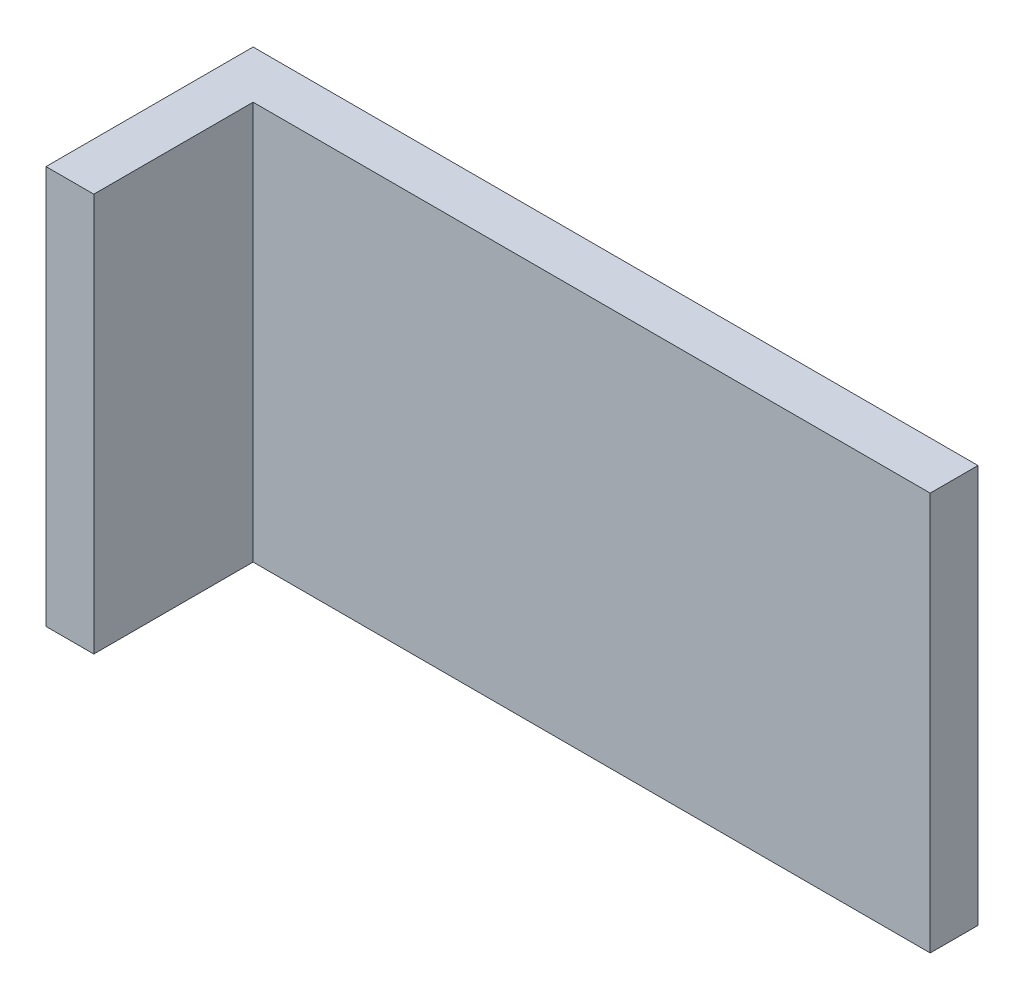
ISO-10303-21;
HEADER;
FILE_DESCRIPTION(('STEP AP214'),'2;1');
FILE_NAME('part.step','',(''),(''),'','','');
FILE_SCHEMA(('AUTOMOTIVE_DESIGN { 1 0 10303 214 1 1 1 1 }'));
ENDSEC;
DATA;
#1=APPLICATION_CONTEXT('core data for automotive mechanical design processes');
#2=APPLICATION_PROTOCOL_DEFINITION('international standard','automotive_design',2000,#1);
#3=PRODUCT_CONTEXT('',#1,'mechanical');
#4=PRODUCT('Part','Part','',(#3));
#5=PRODUCT_RELATED_PRODUCT_CATEGORY('part','',(#4));
#6=PRODUCT_DEFINITION_FORMATION('','',#4);
#7=PRODUCT_DEFINITION_CONTEXT('part definition',#1,'design');
#8=PRODUCT_DEFINITION('design','',#6,#7);
#9=PRODUCT_DEFINITION_SHAPE('','',#8);
#10=(LENGTH_UNIT() NAMED_UNIT(*) SI_UNIT(.MILLI.,.METRE.));
#11=(NAMED_UNIT(*) PLANE_ANGLE_UNIT() SI_UNIT($,.RADIAN.));
#12=(NAMED_UNIT(*) SI_UNIT($,.STERADIAN.) SOLID_ANGLE_UNIT());
#13=UNCERTAINTY_MEASURE_WITH_UNIT(LENGTH_MEASURE(1.E-05),#10,'distance_accuracy_value','');
#14=(GEOMETRIC_REPRESENTATION_CONTEXT(3) GLOBAL_UNCERTAINTY_ASSIGNED_CONTEXT((#13)) GLOBAL_UNIT_ASSIGNED_CONTEXT((#10,
#11,#12)) REPRESENTATION_CONTEXT('',''));
#15=CARTESIAN_POINT('',(0.,0.,0.));
#16=DIRECTION('',(0.,0.,1.));
#17=DIRECTION('',(1.,0.,0.));
#18=AXIS2_PLACEMENT_3D('',#15,#16,#17);
#19=CARTESIAN_POINT('',(-0.03,0.25,0.));
#20=DIRECTION('',(1.,0.,0.));
#21=DIRECTION('',(0.,0.,-1.));
#22=AXIS2_PLACEMENT_3D('',#19,#20,#21);
#23=PLANE('',#22);
#24=DIRECTION('',(0.,1.,0.));
#25=VECTOR('',#24,1.);
#26=CARTESIAN_POINT('',(-0.03,0.,0.));
#27=LINE('',#26,#25);
#28=CARTESIAN_POINT('',(-0.03,0.,0.));
#29=VERTEX_POINT('',#28);
#30=CARTESIAN_POINT('',(-0.03,0.25,0.));
#31=VERTEX_POINT('',#30);
#32=EDGE_CURVE('E20',#29,#31,#27,.T.);
#33=ORIENTED_EDGE('',*,*,#32,.F.);
#34=DIRECTION('',(0.,0.,1.));
#35=VECTOR('',#34,1.);
#36=CARTESIAN_POINT('',(-0.03,0.,0.));
#37=LINE('',#36,#35);
#38=CARTESIAN_POINT('',(-0.03,0.,0.13));
#39=VERTEX_POINT('',#38);
#40=EDGE_CURVE('E68',#29,#39,#37,.T.);
#41=ORIENTED_EDGE('',*,*,#40,.T.);
#42=DIRECTION('',(0.,1.,0.));
#43=VECTOR('',#42,1.);
#44=CARTESIAN_POINT('',(-0.03,0.,0.13));
#45=LINE('',#44,#43);
#46=CARTESIAN_POINT('',(-0.03,0.25,0.13));
#47=VERTEX_POINT('',#46);
#48=EDGE_CURVE('E89',#39,#47,#45,.T.);
#49=ORIENTED_EDGE('',*,*,#48,.T.);
#50=DIRECTION('',(0.,0.,-1.));
#51=VECTOR('',#50,1.);
#52=CARTESIAN_POINT('',(-0.03,0.25,0.13));
#53=LINE('',#52,#51);
#54=EDGE_CURVE('E87',#47,#31,#53,.T.);
#55=ORIENTED_EDGE('',*,*,#54,.T.);
#56=EDGE_LOOP('',(#33,#41,#49,#55));
#57=FACE_BOUND('',#56,.T.);
#58=ADVANCED_FACE('F17',(#57),#23,.F.);
#59=CARTESIAN_POINT('',(0.,0.,0.13));
#60=DIRECTION('',(0.,0.,-1.));
#61=DIRECTION('',(-1.,0.,0.));
#62=AXIS2_PLACEMENT_3D('',#59,#60,#61);
#63=PLANE('',#62);
#64=DIRECTION('',(-1.,0.,0.));
#65=VECTOR('',#64,1.);
#66=CARTESIAN_POINT('',(0.,0.25,0.13));
#67=LINE('',#66,#65);
#68=CARTESIAN_POINT('',(0.,0.25,0.13));
#69=VERTEX_POINT('',#68);
#70=EDGE_CURVE('E93',#47,#69,#67,.F.);
#71=ORIENTED_EDGE('',*,*,#70,.F.);
#72=ORIENTED_EDGE('',*,*,#48,.F.);
#73=DIRECTION('',(-1.,0.,0.));
#74=VECTOR('',#73,1.);
#75=CARTESIAN_POINT('',(0.,0.,0.13));
#76=LINE('',#75,#74);
#77=CARTESIAN_POINT('',(0.,0.,0.13));
#78=VERTEX_POINT('',#77);
#79=EDGE_CURVE('E79',#78,#39,#76,.T.);
#80=ORIENTED_EDGE('',*,*,#79,.F.);
#81=DIRECTION('',(0.,1.,0.));
#82=VECTOR('',#81,1.);
#83=CARTESIAN_POINT('',(0.,0.,0.13));
#84=LINE('',#83,#82);
#85=EDGE_CURVE('E102',#69,#78,#84,.F.);
#86=ORIENTED_EDGE('',*,*,#85,.F.);
#87=EDGE_LOOP('',(#71,#72,#80,#86));
#88=FACE_BOUND('',#87,.T.);
#89=ADVANCED_FACE('F141',(#88),#63,.F.);
#90=CARTESIAN_POINT('',(-0.03,0.,0.));
#91=DIRECTION('',(0.,0.,-1.));
#92=DIRECTION('',(-1.,0.,0.));
#93=AXIS2_PLACEMENT_3D('',#90,#91,#92);
#94=PLANE('',#93);
#95=DIRECTION('',(1.,0.,0.));
#96=VECTOR('',#95,1.);
#97=CARTESIAN_POINT('',(0.425,0.25,0.));
#98=LINE('',#97,#96);
#99=CARTESIAN_POINT('',(0.425,0.25,0.));
#100=VERTEX_POINT('',#99);
#101=EDGE_CURVE('E105',#31,#100,#98,.T.);
#102=ORIENTED_EDGE('',*,*,#101,.T.);
#103=DIRECTION('',(0.,1.,0.));
#104=VECTOR('',#103,1.);
#105=CARTESIAN_POINT('',(0.425,0.,0.));
#106=LINE('',#105,#104);
#107=CARTESIAN_POINT('',(0.425,0.,0.));
#108=VERTEX_POINT('',#107);
#109=EDGE_CURVE('E85',#100,#108,#106,.F.);
#110=ORIENTED_EDGE('',*,*,#109,.T.);
#111=DIRECTION('',(1.,0.,0.));
#112=VECTOR('',#111,1.);
#113=CARTESIAN_POINT('',(-0.03,0.,0.));
#114=LINE('',#113,#112);
#115=EDGE_CURVE('E76',#108,#29,#114,.F.);
#116=ORIENTED_EDGE('',*,*,#115,.T.);
#117=ORIENTED_EDGE('',*,*,#32,.T.);
#118=EDGE_LOOP('',(#102,#110,#116,#117));
#119=FACE_BOUND('',#118,.T.);
#120=ADVANCED_FACE('F83',(#119),#94,.T.);
#121=CARTESIAN_POINT('',(-0.03,0.,0.));
#122=DIRECTION('',(0.,1.,0.));
#123=DIRECTION('',(0.,0.,1.));
#124=AXIS2_PLACEMENT_3D('',#121,#122,#123);
#125=PLANE('',#124);
#126=DIRECTION('',(-1.,0.,0.));
#127=VECTOR('',#126,1.);
#128=CARTESIAN_POINT('',(-0.03,0.,0.03));
#129=LINE('',#128,#127);
#130=CARTESIAN_POINT('',(0.425,0.,0.03));
#131=VERTEX_POINT('',#130);
#132=CARTESIAN_POINT('',(0.,0.,0.03));
#133=VERTEX_POINT('',#132);
#134=EDGE_CURVE('E111',#131,#133,#129,.T.);
#135=ORIENTED_EDGE('',*,*,#134,.T.);
#136=DIRECTION('',(0.,0.,-1.));
#137=VECTOR('',#136,1.);
#138=CARTESIAN_POINT('',(0.,0.,0.));
#139=LINE('',#138,#137);
#140=EDGE_CURVE('E86',#78,#133,#139,.T.);
#141=ORIENTED_EDGE('',*,*,#140,.F.);
#142=ORIENTED_EDGE('',*,*,#79,.T.);
#143=ORIENTED_EDGE('',*,*,#40,.F.);
#144=ORIENTED_EDGE('',*,*,#115,.F.);
#145=DIRECTION('',(0.,0.,1.));
#146=VECTOR('',#145,1.);
#147=CARTESIAN_POINT('',(0.425,0.,0.));
#148=LINE('',#147,#146);
#149=EDGE_CURVE('E107',#108,#131,#148,.T.);
#150=ORIENTED_EDGE('',*,*,#149,.T.);
#151=EDGE_LOOP('',(#135,#141,#142,#143,#144,#150));
#152=FACE_BOUND('',#151,.T.);
#153=ADVANCED_FACE('F74',(#152),#125,.F.);
#154=CARTESIAN_POINT('',(0.,0.,0.));
#155=DIRECTION('',(1.,0.,0.));
#156=DIRECTION('',(0.,0.,-1.));
#157=AXIS2_PLACEMENT_3D('',#154,#155,#156);
#158=PLANE('',#157);
#159=DIRECTION('',(0.,0.,-1.));
#160=VECTOR('',#159,1.);
#161=CARTESIAN_POINT('',(0.,0.25,0.));
#162=LINE('',#161,#160);
#163=CARTESIAN_POINT('',(0.,0.25,0.03));
#164=VERTEX_POINT('',#163);
#165=EDGE_CURVE('E100',#164,#69,#162,.F.);
#166=ORIENTED_EDGE('',*,*,#165,.T.);
#167=ORIENTED_EDGE('',*,*,#85,.T.);
#168=ORIENTED_EDGE('',*,*,#140,.T.);
#169=DIRECTION('',(0.,1.,0.));
#170=VECTOR('',#169,1.);
#171=CARTESIAN_POINT('',(0.,0.,0.03));
#172=LINE('',#171,#170);
#173=EDGE_CURVE('E113',#133,#164,#172,.T.);
#174=ORIENTED_EDGE('',*,*,#173,.T.);
#175=EDGE_LOOP('',(#166,#167,#168,#174));
#176=FACE_BOUND('',#175,.T.);
#177=ADVANCED_FACE('F123',(#176),#158,.T.);
#178=CARTESIAN_POINT('',(0.425,0.25,0.));
#179=DIRECTION('',(0.,-1.,0.));
#180=DIRECTION('',(0.,0.,-1.));
#181=AXIS2_PLACEMENT_3D('',#178,#179,#180);
#182=PLANE('',#181);
#183=DIRECTION('',(-1.,0.,0.));
#184=VECTOR('',#183,1.);
#185=CARTESIAN_POINT('',(-0.03,0.25,0.03));
#186=LINE('',#185,#184);
#187=CARTESIAN_POINT('',(0.425,0.25,0.03));
#188=VERTEX_POINT('',#187);
#189=EDGE_CURVE('E26',#164,#188,#186,.F.);
#190=ORIENTED_EDGE('',*,*,#189,.T.);
#191=DIRECTION('',(0.,0.,1.));
#192=VECTOR('',#191,1.);
#193=CARTESIAN_POINT('',(0.425,0.25,0.));
#194=LINE('',#193,#192);
#195=EDGE_CURVE('E34',#188,#100,#194,.F.);
#196=ORIENTED_EDGE('',*,*,#195,.T.);
#197=ORIENTED_EDGE('',*,*,#101,.F.);
#198=ORIENTED_EDGE('',*,*,#54,.F.);
#199=ORIENTED_EDGE('',*,*,#70,.T.);
#200=ORIENTED_EDGE('',*,*,#165,.F.);
#201=EDGE_LOOP('',(#190,#196,#197,#198,#199,#200));
#202=FACE_BOUND('',#201,.T.);
#203=ADVANCED_FACE('F118',(#202),#182,.F.);
#204=CARTESIAN_POINT('',(0.425,0.,0.));
#205=DIRECTION('',(-1.,0.,0.));
#206=DIRECTION('',(0.,0.,1.));
#207=AXIS2_PLACEMENT_3D('',#204,#205,#206);
#208=PLANE('',#207);
#209=ORIENTED_EDGE('',*,*,#195,.F.);
#210=DIRECTION('',(0.,1.,0.));
#211=VECTOR('',#210,1.);
#212=CARTESIAN_POINT('',(0.425,0.,0.03));
#213=LINE('',#212,#211);
#214=EDGE_CURVE('E11',#188,#131,#213,.F.);
#215=ORIENTED_EDGE('',*,*,#214,.T.);
#216=ORIENTED_EDGE('',*,*,#149,.F.);
#217=ORIENTED_EDGE('',*,*,#109,.F.);
#218=EDGE_LOOP('',(#209,#215,#216,#217));
#219=FACE_BOUND('',#218,.T.);
#220=ADVANCED_FACE('F125',(#219),#208,.F.);
#221=CARTESIAN_POINT('',(-0.03,0.,0.03));
#222=DIRECTION('',(0.,0.,-1.));
#223=DIRECTION('',(-1.,0.,0.));
#224=AXIS2_PLACEMENT_3D('',#221,#222,#223);
#225=PLANE('',#224);
#226=ORIENTED_EDGE('',*,*,#189,.F.);
#227=ORIENTED_EDGE('',*,*,#173,.F.);
#228=ORIENTED_EDGE('',*,*,#134,.F.);
#229=ORIENTED_EDGE('',*,*,#214,.F.);
#230=EDGE_LOOP('',(#226,#227,#228,#229));
#231=FACE_BOUND('',#230,.T.);
#232=ADVANCED_FACE('F121',(#231),#225,.F.);
#233=CLOSED_SHELL('',(#58,#89,#120,#153,#177,#203,#220,#232));
#234=MANIFOLD_SOLID_BREP('B1',#233);
#235=ADVANCED_BREP_SHAPE_REPRESENTATION('',(#18,#234),#14);
#236=SHAPE_DEFINITION_REPRESENTATION(#9,#235);
ENDSEC;
END-ISO-10303-21;
